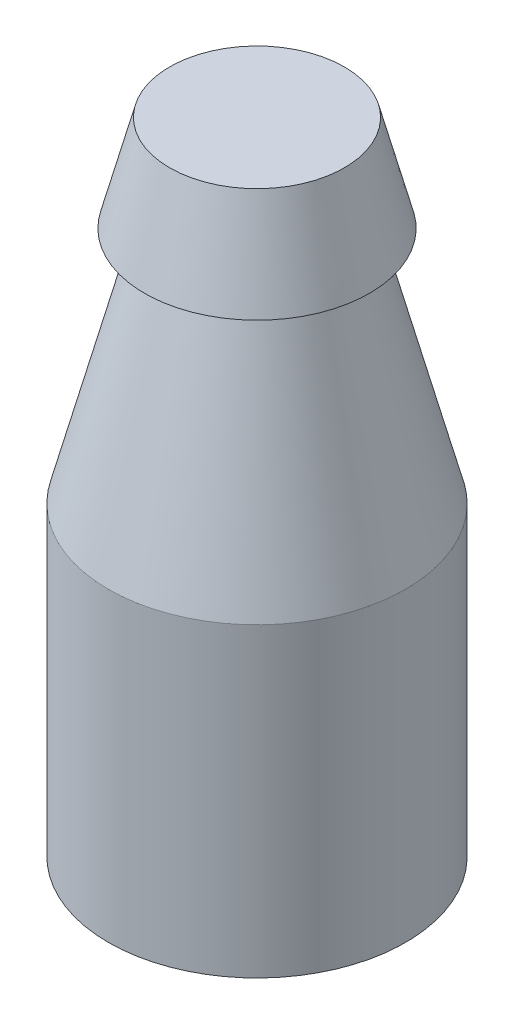
ISO-10303-21;
HEADER;
FILE_DESCRIPTION(('STEP AP214'),'2;1');
FILE_NAME('part.step','',(''),(''),'','','');
FILE_SCHEMA(('AUTOMOTIVE_DESIGN { 1 0 10303 214 1 1 1 1 }'));
ENDSEC;
DATA;
#1=APPLICATION_CONTEXT('core data for automotive mechanical design processes');
#2=APPLICATION_PROTOCOL_DEFINITION('international standard','automotive_design',2000,#1);
#3=PRODUCT_CONTEXT('',#1,'mechanical');
#4=PRODUCT('Part','Part','',(#3));
#5=PRODUCT_RELATED_PRODUCT_CATEGORY('part','',(#4));
#6=PRODUCT_DEFINITION_FORMATION('','',#4);
#7=PRODUCT_DEFINITION_CONTEXT('part definition',#1,'design');
#8=PRODUCT_DEFINITION('design','',#6,#7);
#9=PRODUCT_DEFINITION_SHAPE('','',#8);
#10=(LENGTH_UNIT() NAMED_UNIT(*) SI_UNIT(.MILLI.,.METRE.));
#11=(NAMED_UNIT(*) PLANE_ANGLE_UNIT() SI_UNIT($,.RADIAN.));
#12=(NAMED_UNIT(*) SI_UNIT($,.STERADIAN.) SOLID_ANGLE_UNIT());
#13=UNCERTAINTY_MEASURE_WITH_UNIT(LENGTH_MEASURE(1.E-05),#10,'distance_accuracy_value','');
#14=(GEOMETRIC_REPRESENTATION_CONTEXT(3) GLOBAL_UNCERTAINTY_ASSIGNED_CONTEXT((#13)) GLOBAL_UNIT_ASSIGNED_CONTEXT((#10,
#11,#12)) REPRESENTATION_CONTEXT('',''));
#15=CARTESIAN_POINT('',(0.,0.,0.));
#16=DIRECTION('',(0.,0.,1.));
#17=DIRECTION('',(1.,0.,0.));
#18=AXIS2_PLACEMENT_3D('',#15,#16,#17);
#19=CARTESIAN_POINT('',(0.,-27.336018286844,0.));
#20=DIRECTION('',(0.,1.,0.));
#21=DIRECTION('',(0.,0.,1.));
#22=AXIS2_PLACEMENT_3D('',#19,#20,#21);
#23=PLANE('',#22);
#24=CARTESIAN_POINT('',(0.,-27.336018286844,0.));
#25=DIRECTION('',(0.,-1.,0.));
#26=DIRECTION('',(0.,0.,-1.));
#27=AXIS2_PLACEMENT_3D('',#24,#25,#26);
#28=CIRCLE('',#27,34.);
#29=CARTESIAN_POINT('',(0.,-27.336018286844,-34.));
#30=VERTEX_POINT('',#29);
#31=EDGE_CURVE('E10',#30,#30,#28,.T.);
#32=ORIENTED_EDGE('',*,*,#31,.T.);
#33=EDGE_LOOP('',(#32));
#34=FACE_BOUND('',#33,.T.);
#35=ADVANCED_FACE('F33',(#34),#23,.F.);
#36=CARTESIAN_POINT('',(0.,-27.336018286844,0.));
#37=DIRECTION('',(0.,-1.,0.));
#38=DIRECTION('',(0.,0.,-1.));
#39=AXIS2_PLACEMENT_3D('',#36,#37,#38);
#40=CYLINDRICAL_SURFACE('',#39,34.);
#41=ORIENTED_EDGE('',*,*,#31,.F.);
#42=EDGE_LOOP('',(#41));
#43=FACE_BOUND('',#42,.T.);
#44=CARTESIAN_POINT('',(0.,42.663981713156,0.));
#45=DIRECTION('',(0.,-1.,0.));
#46=DIRECTION('',(0.,0.,-1.));
#47=AXIS2_PLACEMENT_3D('',#44,#45,#46);
#48=CIRCLE('',#47,34.);
#49=CARTESIAN_POINT('',(0.,42.663981713156,-34.));
#50=VERTEX_POINT('',#49);
#51=EDGE_CURVE('E39',#50,#50,#48,.T.);
#52=ORIENTED_EDGE('',*,*,#51,.T.);
#53=EDGE_LOOP('',(#52));
#54=FACE_BOUND('',#53,.T.);
#55=ADVANCED_FACE('F68',(#43,#54),#40,.T.);
#56=CARTESIAN_POINT('',(0.,97.1857208435907,0.));
#57=DIRECTION('',(0.,-1.,0.));
#58=DIRECTION('',(0.,0.,-1.));
#59=AXIS2_PLACEMENT_3D('',#56,#57,#58);
#60=CONICAL_SURFACE('',#59,19.7500000000001,0.255644925277935);
#61=ORIENTED_EDGE('',*,*,#51,.F.);
#62=EDGE_LOOP('',(#61));
#63=FACE_BOUND('',#62,.T.);
#64=CARTESIAN_POINT('',(0.,97.1857208435907,0.));
#65=DIRECTION('',(0.,-1.,0.));
#66=DIRECTION('',(0.,0.,-1.));
#67=AXIS2_PLACEMENT_3D('',#64,#65,#66);
#68=CIRCLE('',#67,19.7500000000001);
#69=CARTESIAN_POINT('',(0.,97.1857208435907,-19.7500000000001));
#70=VERTEX_POINT('',#69);
#71=EDGE_CURVE('E43',#70,#70,#68,.T.);
#72=ORIENTED_EDGE('',*,*,#71,.T.);
#73=EDGE_LOOP('',(#72));
#74=FACE_BOUND('',#73,.T.);
#75=ADVANCED_FACE('F72',(#63,#74),#60,.T.);
#76=CARTESIAN_POINT('',(-19.7500000000001,97.1857208435907,0.));
#77=DIRECTION('',(0.,1.,0.));
#78=DIRECTION('',(0.,0.,1.));
#79=AXIS2_PLACEMENT_3D('',#76,#77,#78);
#80=PLANE('',#79);
#81=ORIENTED_EDGE('',*,*,#71,.F.);
#82=EDGE_LOOP('',(#81));
#83=FACE_BOUND('',#82,.T.);
#84=CARTESIAN_POINT('',(0.,97.1857208435907,0.));
#85=DIRECTION('',(0.,-1.,0.));
#86=DIRECTION('',(0.,0.,-1.));
#87=AXIS2_PLACEMENT_3D('',#84,#85,#86);
#88=CIRCLE('',#87,25.7500000000001);
#89=CARTESIAN_POINT('',(0.,97.1857208435907,-25.7500000000001));
#90=VERTEX_POINT('',#89);
#91=EDGE_CURVE('E47',#90,#90,#88,.T.);
#92=ORIENTED_EDGE('',*,*,#91,.T.);
#93=EDGE_LOOP('',(#92));
#94=FACE_BOUND('',#93,.T.);
#95=ADVANCED_FACE('F64',(#83,#94),#80,.F.);
#96=CARTESIAN_POINT('',(0.,119.185720843591,0.));
#97=DIRECTION('',(0.,-1.,0.));
#98=DIRECTION('',(0.,0.,-1.));
#99=AXIS2_PLACEMENT_3D('',#96,#97,#98);
#100=CONICAL_SURFACE('',#99,20.0000000000001,0.255644925277935);
#101=ORIENTED_EDGE('',*,*,#91,.F.);
#102=EDGE_LOOP('',(#101));
#103=FACE_BOUND('',#102,.T.);
#104=CARTESIAN_POINT('',(0.,119.185720843591,0.));
#105=DIRECTION('',(0.,-1.,0.));
#106=DIRECTION('',(0.,0.,-1.));
#107=AXIS2_PLACEMENT_3D('',#104,#105,#106);
#108=CIRCLE('',#107,20.0000000000001);
#109=CARTESIAN_POINT('',(0.,119.185720843591,-20.0000000000001));
#110=VERTEX_POINT('',#109);
#111=EDGE_CURVE('E52',#110,#110,#108,.T.);
#112=ORIENTED_EDGE('',*,*,#111,.T.);
#113=EDGE_LOOP('',(#112));
#114=FACE_BOUND('',#113,.T.);
#115=ADVANCED_FACE('F56',(#103,#114),#100,.T.);
#116=CARTESIAN_POINT('',(-20.0000000000001,119.185720843591,0.));
#117=DIRECTION('',(0.,-1.,0.));
#118=DIRECTION('',(0.,0.,-1.));
#119=AXIS2_PLACEMENT_3D('',#116,#117,#118);
#120=PLANE('',#119);
#121=ORIENTED_EDGE('',*,*,#111,.F.);
#122=EDGE_LOOP('',(#121));
#123=FACE_BOUND('',#122,.T.);
#124=ADVANCED_FACE('F58',(#123),#120,.F.);
#125=CLOSED_SHELL('',(#35,#55,#75,#95,#115,#124));
#126=MANIFOLD_SOLID_BREP('B2',#125);
#127=ADVANCED_BREP_SHAPE_REPRESENTATION('',(#18,#126),#14);
#128=SHAPE_DEFINITION_REPRESENTATION(#9,#127);
ENDSEC;
END-ISO-10303-21;
